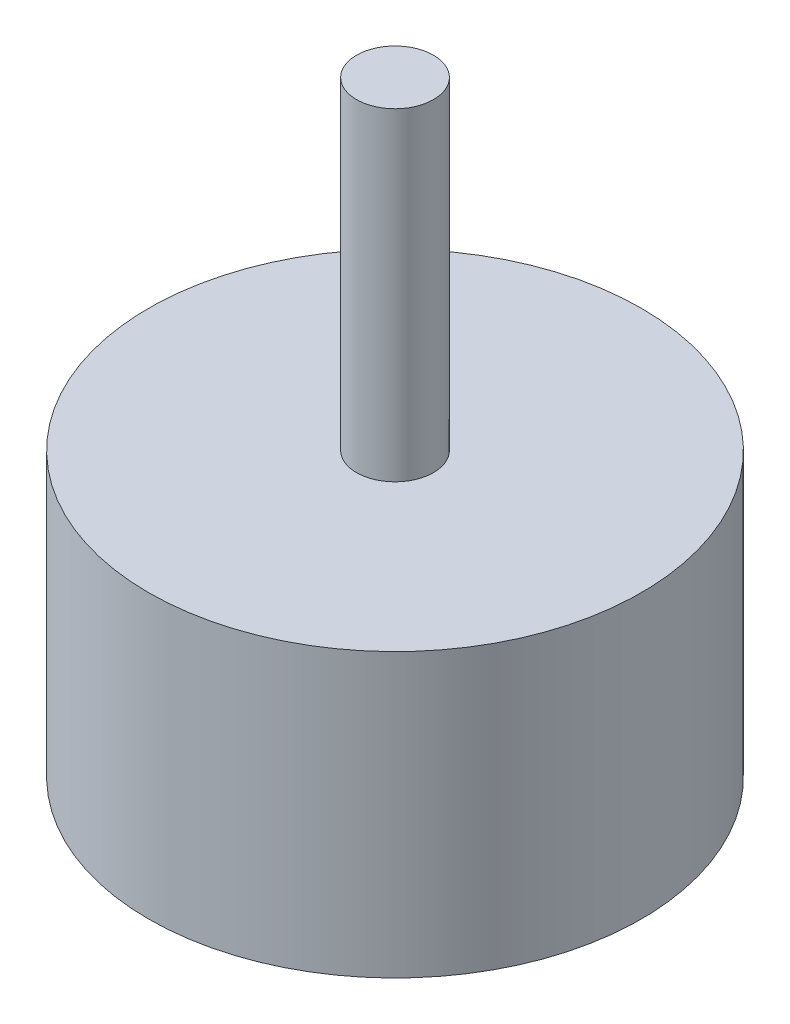
ISO-10303-21;
HEADER;
FILE_DESCRIPTION(('STEP AP214'),'2;1');
FILE_NAME('part.step','',(''),(''),'','','');
FILE_SCHEMA(('AUTOMOTIVE_DESIGN { 1 0 10303 214 1 1 1 1 }'));
ENDSEC;
DATA;
#1=APPLICATION_CONTEXT('core data for automotive mechanical design processes');
#2=APPLICATION_PROTOCOL_DEFINITION('international standard','automotive_design',2000,#1);
#3=PRODUCT_CONTEXT('',#1,'mechanical');
#4=PRODUCT('Part','Part','',(#3));
#5=PRODUCT_RELATED_PRODUCT_CATEGORY('part','',(#4));
#6=PRODUCT_DEFINITION_FORMATION('','',#4);
#7=PRODUCT_DEFINITION_CONTEXT('part definition',#1,'design');
#8=PRODUCT_DEFINITION('design','',#6,#7);
#9=PRODUCT_DEFINITION_SHAPE('','',#8);
#10=(LENGTH_UNIT() NAMED_UNIT(*) SI_UNIT(.MILLI.,.METRE.));
#11=(NAMED_UNIT(*) PLANE_ANGLE_UNIT() SI_UNIT($,.RADIAN.));
#12=(NAMED_UNIT(*) SI_UNIT($,.STERADIAN.) SOLID_ANGLE_UNIT());
#13=UNCERTAINTY_MEASURE_WITH_UNIT(LENGTH_MEASURE(1.E-05),#10,'distance_accuracy_value','');
#14=(GEOMETRIC_REPRESENTATION_CONTEXT(3) GLOBAL_UNCERTAINTY_ASSIGNED_CONTEXT((#13)) GLOBAL_UNIT_ASSIGNED_CONTEXT((#10,
#11,#12)) REPRESENTATION_CONTEXT('',''));
#15=CARTESIAN_POINT('',(0.,0.,0.));
#16=DIRECTION('',(0.,0.,1.));
#17=DIRECTION('',(1.,0.,0.));
#18=AXIS2_PLACEMENT_3D('',#15,#16,#17);
#19=CARTESIAN_POINT('',(-30.5,0.,0.));
#20=DIRECTION('',(0.,1.,0.));
#21=DIRECTION('',(0.,0.,1.));
#22=AXIS2_PLACEMENT_3D('',#19,#20,#21);
#23=PLANE('',#22);
#24=CARTESIAN_POINT('',(0.,0.,0.));
#25=DIRECTION('',(0.,-1.,0.));
#26=DIRECTION('',(0.,0.,-1.));
#27=AXIS2_PLACEMENT_3D('',#24,#25,#26);
#28=CIRCLE('',#27,30.5);
#29=CARTESIAN_POINT('',(0.,0.,-30.5));
#30=VERTEX_POINT('',#29);
#31=EDGE_CURVE('E54',#30,#30,#28,.T.);
#32=ORIENTED_EDGE('',*,*,#31,.T.);
#33=EDGE_LOOP('',(#32));
#34=FACE_BOUND('',#33,.T.);
#35=ADVANCED_FACE('F37',(#34),#23,.F.);
#36=CARTESIAN_POINT('',(0.,75.,0.));
#37=DIRECTION('',(0.,-1.,0.));
#38=DIRECTION('',(0.,0.,-1.));
#39=AXIS2_PLACEMENT_3D('',#36,#37,#38);
#40=PLANE('',#39);
#41=CARTESIAN_POINT('',(0.,75.,0.));
#42=DIRECTION('',(0.,-1.,0.));
#43=DIRECTION('',(0.,0.,-1.));
#44=AXIS2_PLACEMENT_3D('',#41,#42,#43);
#45=CIRCLE('',#44,4.7625);
#46=CARTESIAN_POINT('',(0.,75.,-4.7625));
#47=VERTEX_POINT('',#46);
#48=EDGE_CURVE('E10',#47,#47,#45,.T.);
#49=ORIENTED_EDGE('',*,*,#48,.F.);
#50=EDGE_LOOP('',(#49));
#51=FACE_BOUND('',#50,.T.);
#52=ADVANCED_FACE('F75',(#51),#40,.F.);
#53=CARTESIAN_POINT('',(0.,0.,0.));
#54=DIRECTION('',(0.,-1.,0.));
#55=DIRECTION('',(0.,0.,-1.));
#56=AXIS2_PLACEMENT_3D('',#53,#54,#55);
#57=CYLINDRICAL_SURFACE('',#56,4.7625);
#58=CARTESIAN_POINT('',(0.,35.,0.));
#59=DIRECTION('',(0.,-1.,0.));
#60=DIRECTION('',(0.,0.,-1.));
#61=AXIS2_PLACEMENT_3D('',#58,#59,#60);
#62=CIRCLE('',#61,4.7625);
#63=CARTESIAN_POINT('',(0.,35.,-4.7625));
#64=VERTEX_POINT('',#63);
#65=EDGE_CURVE('E44',#64,#64,#62,.T.);
#66=ORIENTED_EDGE('',*,*,#65,.F.);
#67=EDGE_LOOP('',(#66));
#68=FACE_BOUND('',#67,.T.);
#69=ORIENTED_EDGE('',*,*,#48,.T.);
#70=EDGE_LOOP('',(#69));
#71=FACE_BOUND('',#70,.T.);
#72=ADVANCED_FACE('F70',(#68,#71),#57,.T.);
#73=CARTESIAN_POINT('',(-4.7625,35.,0.));
#74=DIRECTION('',(0.,-1.,0.));
#75=DIRECTION('',(0.,0.,-1.));
#76=AXIS2_PLACEMENT_3D('',#73,#74,#75);
#77=PLANE('',#76);
#78=CARTESIAN_POINT('',(0.,35.,0.));
#79=DIRECTION('',(0.,-1.,0.));
#80=DIRECTION('',(0.,0.,-1.));
#81=AXIS2_PLACEMENT_3D('',#78,#79,#80);
#82=CIRCLE('',#81,30.5);
#83=CARTESIAN_POINT('',(0.,35.,-30.5));
#84=VERTEX_POINT('',#83);
#85=EDGE_CURVE('E49',#84,#84,#82,.T.);
#86=ORIENTED_EDGE('',*,*,#85,.F.);
#87=EDGE_LOOP('',(#86));
#88=FACE_BOUND('',#87,.T.);
#89=ORIENTED_EDGE('',*,*,#65,.T.);
#90=EDGE_LOOP('',(#89));
#91=FACE_BOUND('',#90,.T.);
#92=ADVANCED_FACE('F65',(#88,#91),#77,.F.);
#93=CARTESIAN_POINT('',(0.,0.,0.));
#94=DIRECTION('',(0.,-1.,0.));
#95=DIRECTION('',(0.,0.,-1.));
#96=AXIS2_PLACEMENT_3D('',#93,#94,#95);
#97=CYLINDRICAL_SURFACE('',#96,30.5);
#98=ORIENTED_EDGE('',*,*,#31,.F.);
#99=EDGE_LOOP('',(#98));
#100=FACE_BOUND('',#99,.T.);
#101=ORIENTED_EDGE('',*,*,#85,.T.);
#102=EDGE_LOOP('',(#101));
#103=FACE_BOUND('',#102,.T.);
#104=ADVANCED_FACE('F62',(#100,#103),#97,.T.);
#105=CLOSED_SHELL('',(#35,#52,#72,#92,#104));
#106=MANIFOLD_SOLID_BREP('B2',#105);
#107=ADVANCED_BREP_SHAPE_REPRESENTATION('',(#18,#106),#14);
#108=SHAPE_DEFINITION_REPRESENTATION(#9,#107);
ENDSEC;
END-ISO-10303-21;
